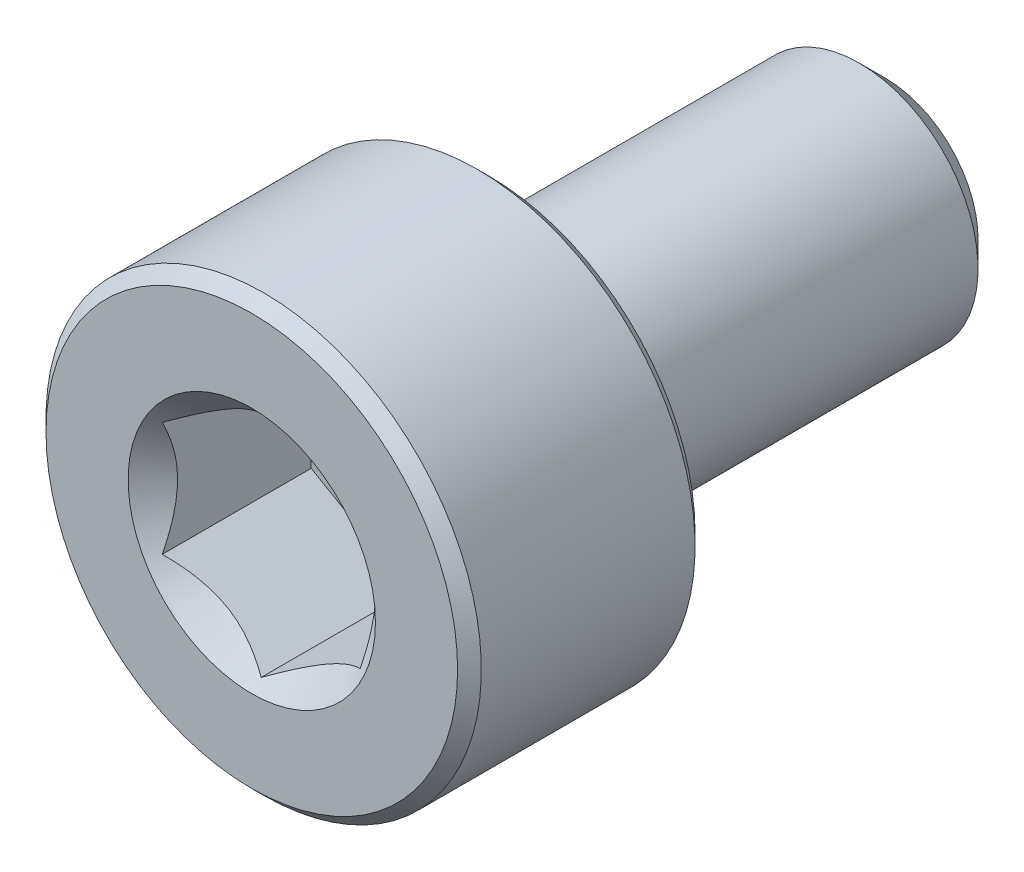
ISO-10303-21;
HEADER;
FILE_DESCRIPTION(('STEP AP214'),'2;1');
FILE_NAME('part.step','',(''),(''),'','','');
FILE_SCHEMA(('AUTOMOTIVE_DESIGN { 1 0 10303 214 1 1 1 1 }'));
ENDSEC;
DATA;
#1=APPLICATION_CONTEXT('core data for automotive mechanical design processes');
#2=APPLICATION_PROTOCOL_DEFINITION('international standard','automotive_design',2000,#1);
#3=PRODUCT_CONTEXT('',#1,'mechanical');
#4=PRODUCT('Part','Part','',(#3));
#5=PRODUCT_RELATED_PRODUCT_CATEGORY('part','',(#4));
#6=PRODUCT_DEFINITION_FORMATION('','',#4);
#7=PRODUCT_DEFINITION_CONTEXT('part definition',#1,'design');
#8=PRODUCT_DEFINITION('design','',#6,#7);
#9=PRODUCT_DEFINITION_SHAPE('','',#8);
#10=(LENGTH_UNIT() NAMED_UNIT(*) SI_UNIT(.MILLI.,.METRE.));
#11=(NAMED_UNIT(*) PLANE_ANGLE_UNIT() SI_UNIT($,.RADIAN.));
#12=(NAMED_UNIT(*) SI_UNIT($,.STERADIAN.) SOLID_ANGLE_UNIT());
#13=UNCERTAINTY_MEASURE_WITH_UNIT(LENGTH_MEASURE(1.E-05),#10,'distance_accuracy_value','');
#14=(GEOMETRIC_REPRESENTATION_CONTEXT(3) GLOBAL_UNCERTAINTY_ASSIGNED_CONTEXT((#13)) GLOBAL_UNIT_ASSIGNED_CONTEXT((#10,
#11,#12)) REPRESENTATION_CONTEXT('',''));
#15=CARTESIAN_POINT('',(0.,0.,0.));
#16=DIRECTION('',(0.,0.,1.));
#17=DIRECTION('',(1.,0.,0.));
#18=AXIS2_PLACEMENT_3D('',#15,#16,#17);
#19=CARTESIAN_POINT('',(0.,1.17524047358084,-4.));
#20=DIRECTION('',(0.,0.,-1.));
#21=DIRECTION('',(0.,1.,0.));
#22=AXIS2_PLACEMENT_3D('',#19,#20,#21);
#23=PLANE('',#22);
#24=CARTESIAN_POINT('',(0.,0.,-4.));
#25=DIRECTION('',(0.,0.,-1.));
#26=DIRECTION('',(0.,1.,0.));
#27=AXIS2_PLACEMENT_3D('',#24,#25,#26);
#28=CIRCLE('',#27,1.17524047358084);
#29=CARTESIAN_POINT('',(0.,1.17524047358084,-4.));
#30=VERTEX_POINT('',#29);
#31=EDGE_CURVE('E54',#30,#30,#28,.T.);
#32=ORIENTED_EDGE('',*,*,#31,.T.);
#33=EDGE_LOOP('',(#32));
#34=FACE_BOUND('',#33,.T.);
#35=ADVANCED_FACE('F41',(#34),#23,.T.);
#36=CARTESIAN_POINT('',(0.,0.,-4.));
#37=DIRECTION('',(0.,0.,1.));
#38=DIRECTION('',(0.,-1.,0.));
#39=AXIS2_PLACEMENT_3D('',#36,#37,#38);
#40=CONICAL_SURFACE('',#39,1.17524047358084,0.785398163397444);
#41=CARTESIAN_POINT('',(0.,0.,-3.67524047358083));
#42=DIRECTION('',(0.,0.,-1.));
#43=DIRECTION('',(0.,1.,0.));
#44=AXIS2_PLACEMENT_3D('',#41,#42,#43);
#45=CIRCLE('',#44,1.5);
#46=CARTESIAN_POINT('',(0.,1.5,-3.67524047358083));
#47=VERTEX_POINT('',#46);
#48=EDGE_CURVE('E157',#47,#47,#45,.T.);
#49=ORIENTED_EDGE('',*,*,#48,.T.);
#50=EDGE_LOOP('',(#49));
#51=FACE_BOUND('',#50,.T.);
#52=ORIENTED_EDGE('',*,*,#31,.F.);
#53=EDGE_LOOP('',(#52));
#54=FACE_BOUND('',#53,.T.);
#55=ADVANCED_FACE('F163',(#51,#54),#40,.T.);
#56=CARTESIAN_POINT('',(0.,0.,-4.));
#57=DIRECTION('',(0.,0.,-1.));
#58=DIRECTION('',(0.,1.,0.));
#59=AXIS2_PLACEMENT_3D('',#56,#57,#58);
#60=CYLINDRICAL_SURFACE('',#59,1.5);
#61=CARTESIAN_POINT('',(0.,0.,0.850000000000002));
#62=DIRECTION('',(0.,0.,-1.));
#63=DIRECTION('',(0.,1.,0.));
#64=AXIS2_PLACEMENT_3D('',#61,#62,#63);
#65=CIRCLE('',#64,1.5);
#66=CARTESIAN_POINT('',(0.,1.5,0.850000000000002));
#67=VERTEX_POINT('',#66);
#68=EDGE_CURVE('E154',#67,#67,#65,.T.);
#69=ORIENTED_EDGE('',*,*,#68,.T.);
#70=EDGE_LOOP('',(#69));
#71=FACE_BOUND('',#70,.T.);
#72=ORIENTED_EDGE('',*,*,#48,.F.);
#73=EDGE_LOOP('',(#72));
#74=FACE_BOUND('',#73,.T.);
#75=ADVANCED_FACE('F165',(#71,#74),#60,.T.);
#76=CARTESIAN_POINT('',(0.,0.,0.850000000000002));
#77=DIRECTION('',(0.,0.,-1.));
#78=DIRECTION('',(0.,1.,0.));
#79=AXIS2_PLACEMENT_3D('',#76,#77,#78);
#80=TOROIDAL_SURFACE('',#79,1.65,0.15);
#81=CARTESIAN_POINT('',(0.,0.,1.));
#82=DIRECTION('',(0.,0.,-1.));
#83=DIRECTION('',(0.,1.,0.));
#84=AXIS2_PLACEMENT_3D('',#81,#82,#83);
#85=CIRCLE('',#84,1.65);
#86=CARTESIAN_POINT('',(0.,1.65,1.));
#87=VERTEX_POINT('',#86);
#88=EDGE_CURVE('E151',#87,#87,#85,.T.);
#89=ORIENTED_EDGE('',*,*,#88,.T.);
#90=EDGE_LOOP('',(#89));
#91=FACE_BOUND('',#90,.T.);
#92=ORIENTED_EDGE('',*,*,#68,.F.);
#93=EDGE_LOOP('',(#92));
#94=FACE_BOUND('',#93,.T.);
#95=ADVANCED_FACE('F171',(#91,#94),#80,.F.);
#96=CARTESIAN_POINT('',(0.,2.6,1.));
#97=DIRECTION('',(0.,0.,-1.));
#98=DIRECTION('',(0.,1.,0.));
#99=AXIS2_PLACEMENT_3D('',#96,#97,#98);
#100=PLANE('',#99);
#101=CARTESIAN_POINT('',(0.,0.,1.));
#102=DIRECTION('',(0.,0.,-1.));
#103=DIRECTION('',(0.,1.,0.));
#104=AXIS2_PLACEMENT_3D('',#101,#102,#103);
#105=CIRCLE('',#104,2.6);
#106=CARTESIAN_POINT('',(0.,2.6,1.));
#107=VERTEX_POINT('',#106);
#108=EDGE_CURVE('E148',#107,#107,#105,.T.);
#109=ORIENTED_EDGE('',*,*,#108,.T.);
#110=EDGE_LOOP('',(#109));
#111=FACE_BOUND('',#110,.T.);
#112=ORIENTED_EDGE('',*,*,#88,.F.);
#113=EDGE_LOOP('',(#112));
#114=FACE_BOUND('',#113,.T.);
#115=ADVANCED_FACE('F177',(#111,#114),#100,.T.);
#116=CARTESIAN_POINT('',(0.,0.,1.));
#117=DIRECTION('',(0.,0.,1.));
#118=DIRECTION('',(0.,-1.,0.));
#119=AXIS2_PLACEMENT_3D('',#116,#117,#118);
#120=CONICAL_SURFACE('',#119,2.6,0.785398163397448);
#121=CARTESIAN_POINT('',(0.,0.,1.15));
#122=DIRECTION('',(0.,0.,-1.));
#123=DIRECTION('',(0.,1.,0.));
#124=AXIS2_PLACEMENT_3D('',#121,#122,#123);
#125=CIRCLE('',#124,2.75);
#126=CARTESIAN_POINT('',(0.,2.75,1.15));
#127=VERTEX_POINT('',#126);
#128=EDGE_CURVE('E145',#127,#127,#125,.T.);
#129=ORIENTED_EDGE('',*,*,#128,.T.);
#130=EDGE_LOOP('',(#129));
#131=FACE_BOUND('',#130,.T.);
#132=ORIENTED_EDGE('',*,*,#108,.F.);
#133=EDGE_LOOP('',(#132));
#134=FACE_BOUND('',#133,.T.);
#135=ADVANCED_FACE('F181',(#131,#134),#120,.T.);
#136=CARTESIAN_POINT('',(0.,0.,-4.));
#137=DIRECTION('',(0.,0.,-1.));
#138=DIRECTION('',(0.,1.,0.));
#139=AXIS2_PLACEMENT_3D('',#136,#137,#138);
#140=CYLINDRICAL_SURFACE('',#139,2.75);
#141=CARTESIAN_POINT('',(0.,0.,3.85));
#142=DIRECTION('',(0.,0.,-1.));
#143=DIRECTION('',(0.,1.,0.));
#144=AXIS2_PLACEMENT_3D('',#141,#142,#143);
#145=CIRCLE('',#144,2.75);
#146=CARTESIAN_POINT('',(0.,2.75,3.85));
#147=VERTEX_POINT('',#146);
#148=EDGE_CURVE('E142',#147,#147,#145,.T.);
#149=ORIENTED_EDGE('',*,*,#148,.T.);
#150=EDGE_LOOP('',(#149));
#151=FACE_BOUND('',#150,.T.);
#152=ORIENTED_EDGE('',*,*,#128,.F.);
#153=EDGE_LOOP('',(#152));
#154=FACE_BOUND('',#153,.T.);
#155=ADVANCED_FACE('F185',(#151,#154),#140,.T.);
#156=CARTESIAN_POINT('',(0.,0.,3.85));
#157=DIRECTION('',(0.,0.,-1.));
#158=DIRECTION('',(0.,1.,0.));
#159=AXIS2_PLACEMENT_3D('',#156,#157,#158);
#160=CONICAL_SURFACE('',#159,2.75,0.785398163397445);
#161=CARTESIAN_POINT('',(0.,0.,4.));
#162=DIRECTION('',(0.,0.,-1.));
#163=DIRECTION('',(0.,1.,0.));
#164=AXIS2_PLACEMENT_3D('',#161,#162,#163);
#165=CIRCLE('',#164,2.6);
#166=CARTESIAN_POINT('',(0.,2.6,4.));
#167=VERTEX_POINT('',#166);
#168=EDGE_CURVE('E139',#167,#167,#165,.T.);
#169=ORIENTED_EDGE('',*,*,#168,.T.);
#170=EDGE_LOOP('',(#169));
#171=FACE_BOUND('',#170,.T.);
#172=ORIENTED_EDGE('',*,*,#148,.F.);
#173=EDGE_LOOP('',(#172));
#174=FACE_BOUND('',#173,.T.);
#175=ADVANCED_FACE('F189',(#171,#174),#160,.T.);
#176=CARTESIAN_POINT('',(0.,0.,4.));
#177=DIRECTION('',(0.,0.,1.));
#178=DIRECTION('',(0.,-1.,0.));
#179=AXIS2_PLACEMENT_3D('',#176,#177,#178);
#180=PLANE('',#179);
#181=CARTESIAN_POINT('',(0.,0.,4.));
#182=DIRECTION('',(0.,0.,1.));
#183=DIRECTION('',(1.,0.,0.));
#184=AXIS2_PLACEMENT_3D('',#181,#182,#183);
#185=CIRCLE('',#184,1.5625);
#186=CARTESIAN_POINT('',(1.5625,0.,4.));
#187=VERTEX_POINT('',#186);
#188=EDGE_CURVE('E113',#187,#187,#185,.T.);
#189=ORIENTED_EDGE('',*,*,#188,.F.);
#190=EDGE_LOOP('',(#189));
#191=FACE_BOUND('',#190,.T.);
#192=ORIENTED_EDGE('',*,*,#168,.F.);
#193=EDGE_LOOP('',(#192));
#194=FACE_BOUND('',#193,.T.);
#195=ADVANCED_FACE('F193',(#191,#194),#180,.T.);
#196=CARTESIAN_POINT('',(0.,0.,4.));
#197=DIRECTION('',(0.,0.,1.));
#198=DIRECTION('',(1.,0.,0.));
#199=AXIS2_PLACEMENT_3D('',#196,#197,#198);
#200=CONICAL_SURFACE('',#199,1.5625,0.78539816339745);
#201=ORIENTED_EDGE('',*,*,#188,.T.);
#202=EDGE_LOOP('',(#201));
#203=FACE_BOUND('',#202,.T.);
#204=CARTESIAN_POINT('',(-0.000200000000000281,-1.4434911430279,3.8809911568832));
#205=CARTESIAN_POINT('',(0.0427751670715864,-1.41867941875065,3.85619734102917));
#206=CARTESIAN_POINT('',(0.0864690047459478,-1.39345276980743,3.83285940739275));
#207=CARTESIAN_POINT('',(0.175565930841942,-1.34201263554194,3.7901276770586));
#208=CARTESIAN_POINT('',(0.220977498357064,-1.31579425481276,3.77075766533448));
#209=CARTESIAN_POINT('',(0.31254782093526,-1.26292610442246,3.73757615638754));
#210=CARTESIAN_POINT('',(0.358683240175885,-1.23628980770471,3.72368123202672));
#211=CARTESIAN_POINT('',(0.451970080407592,-1.18243062538508,3.7022729551347));
#212=CARTESIAN_POINT('',(0.49911864913638,-1.15520938653761,3.69474361454085));
#213=CARTESIAN_POINT('',(0.580373556887252,-1.10829684367467,3.68795017102477));
#214=CARTESIAN_POINT('',(0.614374876627941,-1.08866617256958,3.68694423207841));
#215=CARTESIAN_POINT('',(0.682317764432477,-1.04943932800611,3.68863708788538));
#216=CARTESIAN_POINT('',(0.716259317655657,-1.02984316311599,3.6913367001896));
#217=CARTESIAN_POINT('',(0.783814856457499,-0.990839954603499,3.70028460329044));
#218=CARTESIAN_POINT('',(0.817428507286775,-0.971433104248771,3.70653619887377));
#219=CARTESIAN_POINT('',(0.884094638217813,-0.932943395609905,3.72225135438797));
#220=CARTESIAN_POINT('',(0.917146871030295,-0.9138606800983,3.73171629306152));
#221=CARTESIAN_POINT('',(1.00179969160026,-0.864986351354568,3.75980706366165));
#222=CARTESIAN_POINT('',(1.05286649242964,-0.835502920149076,3.78054583042626));
#223=CARTESIAN_POINT('',(1.15300085411325,-0.777690319475908,3.82726280764554));
#224=CARTESIAN_POINT('',(1.20207431157827,-0.749357745598417,3.85322396892083));
#225=CARTESIAN_POINT('',(1.2502,-0.721572366433194,3.8809911568832));
#226=B_SPLINE_CURVE_WITH_KNOTS('',3,(#204,#205,#206,#207,#208,#209,#210,#211,#212,#213,#214,
#215,#216,#217,#218,#219,#220,#221,#222,#223,#224,#225),.UNSPECIFIED.,.F.,.F.,(4,2,2,2,2,2,2,2,
2,2,4),(0.,0.166533409618304,0.334037607289762,0.498880396489698,0.663307919240275,
0.780963963458827,0.898645970148453,1.01643764860773,1.13427993171549,1.32148652032141,
1.50809158792574),.UNSPECIFIED.);
#227=CARTESIAN_POINT('',(0.,-1.44337567297406,3.88087567297406));
#228=VERTEX_POINT('',#227);
#229=CARTESIAN_POINT('',(1.25,-0.721687836487032,3.88087567297406));
#230=VERTEX_POINT('',#229);
#231=EDGE_CURVE('E12',#228,#230,#226,.T.);
#232=ORIENTED_EDGE('',*,*,#231,.F.);
#233=CARTESIAN_POINT('',(-1.2502,-0.721572366433195,3.8809911568832));
#234=CARTESIAN_POINT('',(-1.20722483292841,-0.746384090710444,3.85619734102917));
#235=CARTESIAN_POINT('',(-1.16353099525405,-0.771610739653665,3.83285940739275));
#236=CARTESIAN_POINT('',(-1.07443406915806,-0.823050873919155,3.7901276770586));
#237=CARTESIAN_POINT('',(-1.02902250164294,-0.849269254648334,3.77075766533448));
#238=CARTESIAN_POINT('',(-0.93745217906474,-0.902137405038636,3.73757615638754));
#239=CARTESIAN_POINT('',(-0.891316759824115,-0.928773701756387,3.72368123202672));
#240=CARTESIAN_POINT('',(-0.798029919592408,-0.982632884076013,3.7022729551347));
#241=CARTESIAN_POINT('',(-0.75088135086362,-1.00985412292348,3.69474361454085));
#242=CARTESIAN_POINT('',(-0.669626443112748,-1.05676666578643,3.68795017102477));
#243=CARTESIAN_POINT('',(-0.635625123372059,-1.07639733689152,3.68694423207841));
#244=CARTESIAN_POINT('',(-0.567682235567522,-1.11562418145499,3.68863708788538));
#245=CARTESIAN_POINT('',(-0.533740682344342,-1.1352203463451,3.6913367001896));
#246=CARTESIAN_POINT('',(-0.4661851435425,-1.1742235548576,3.70028460329044));
#247=CARTESIAN_POINT('',(-0.432571492713225,-1.19363040521233,3.70653619887377));
#248=CARTESIAN_POINT('',(-0.365905361782187,-1.23212011385119,3.72225135438797));
#249=CARTESIAN_POINT('',(-0.332853128969704,-1.2512028293628,3.73171629306152));
#250=CARTESIAN_POINT('',(-0.248200308399735,-1.30007715810653,3.75980706366165));
#251=CARTESIAN_POINT('',(-0.197133507570361,-1.32956058931202,3.78054583042627));
#252=CARTESIAN_POINT('',(-0.0969991458867449,-1.38737318998519,3.82726280764554));
#253=CARTESIAN_POINT('',(-0.0479256884217305,-1.41570576386268,3.85322396892083));
#254=CARTESIAN_POINT('',(0.00019999999999992,-1.4434911430279,3.8809911568832));
#255=B_SPLINE_CURVE_WITH_KNOTS('',3,(#233,#234,#235,#236,#237,#238,#239,#240,#241,#242,#243,
#244,#245,#246,#247,#248,#249,#250,#251,#252,#253,#254),.UNSPECIFIED.,.F.,.F.,(4,2,2,2,2,2,2,2,
2,2,4),(0.,0.166533409618304,0.334037607289762,0.498880396489698,0.663307919240275,
0.780963963458827,0.898645970148453,1.01643764860773,1.1342799317155,1.32148652032141,
1.50809158792574),.UNSPECIFIED.);
#256=CARTESIAN_POINT('',(-1.25,-0.721687836487033,3.88087567297406));
#257=VERTEX_POINT('',#256);
#258=EDGE_CURVE('E99',#257,#228,#255,.T.);
#259=ORIENTED_EDGE('',*,*,#258,.F.);
#260=CARTESIAN_POINT('',(-1.25,-1.52906039618109,4.41247485937656));
#261=CARTESIAN_POINT('',(-1.25,-1.49220529080579,4.38394520440545));
#262=CARTESIAN_POINT('',(-1.25,-1.45515496684494,4.35566856788859));
#263=CARTESIAN_POINT('',(-1.25,-1.38058140838662,4.29972834081338));
#264=CARTESIAN_POINT('',(-1.25,-1.34305806621138,4.27206489394419));
#265=CARTESIAN_POINT('',(-1.25,-1.22910675079842,4.18976023403817));
#266=CARTESIAN_POINT('',(-1.25,-1.15185483124782,4.13624146268623));
#267=CARTESIAN_POINT('',(-1.25,-0.989252377816228,4.03031168703531));
#268=CARTESIAN_POINT('',(-1.25,-0.903702856150537,3.97820301658352));
#269=CARTESIAN_POINT('',(-1.25,-0.728224302589146,3.88229295817095));
#270=CARTESIAN_POINT('',(-1.25,-0.638311408271527,3.83846351429438));
#271=CARTESIAN_POINT('',(-1.25,-0.504179528176993,3.78481796944124));
#272=CARTESIAN_POINT('',(-1.25,-0.462140309604462,3.76958311655924));
#273=CARTESIAN_POINT('',(-1.25,-0.376968358930113,3.74248027967488));
#274=CARTESIAN_POINT('',(-1.25,-0.333835559023206,3.73061250499961));
#275=CARTESIAN_POINT('',(-1.25,-0.247500786382209,3.71108793058395));
#276=CARTESIAN_POINT('',(-1.25,-0.204316746020218,3.70335314062603));
#277=CARTESIAN_POINT('',(-1.25,-0.117386820033729,3.69226051149026));
#278=CARTESIAN_POINT('',(-1.25,-0.0736410606163112,3.68890170591012));
#279=CARTESIAN_POINT('',(-1.25,0.0119255032765032,3.68685912442193));
#280=CARTESIAN_POINT('',(-1.25,0.0537413250189258,3.68796541806101));
#281=CARTESIAN_POINT('',(-1.25,0.137056635467402,3.69430478308355));
#282=CARTESIAN_POINT('',(-1.25,0.178556095869134,3.69953821944028));
#283=CARTESIAN_POINT('',(-1.25,0.261643418190125,3.71392095567135));
#284=CARTESIAN_POINT('',(-1.25,0.303218962688244,3.72314026055592));
#285=CARTESIAN_POINT('',(-1.25,0.385447906554255,3.74497795035777));
#286=CARTESIAN_POINT('',(-1.25,0.426101349364106,3.75759617478337));
#287=CARTESIAN_POINT('',(-1.25,0.55031875610095,3.80099995648882));
#288=CARTESIAN_POINT('',(-1.25,0.632206913819509,3.83656592610618));
#289=CARTESIAN_POINT('',(-1.25,0.792163832901716,3.91573000476451));
#290=CARTESIAN_POINT('',(-1.25,0.870217968244435,3.95935624183847));
#291=CARTESIAN_POINT('',(-1.25,1.01943092253057,4.04945332591182));
#292=CARTESIAN_POINT('',(-1.25,1.09074002929844,4.09567842626371));
#293=CARTESIAN_POINT('',(-1.25,1.19579897437392,4.16717891685916));
#294=CARTESIAN_POINT('',(-1.25,1.23036719648395,4.19127266485707));
#295=CARTESIAN_POINT('',(-1.25,1.29902897795883,4.24010822093429));
#296=CARTESIAN_POINT('',(-1.25,1.33312266558282,4.2648498484799));
#297=CARTESIAN_POINT('',(-1.25,1.36701837723592,4.28986045188314));
#298=B_SPLINE_CURVE_WITH_KNOTS('',3,(#260,#261,#262,#263,#264,#265,#266,#267,#268,#269,#270,
#271,#272,#273,#274,#275,#276,#277,#278,#279,#280,#281,#282,#283,#284,#285,#286,#287,#288,#289,
#290,#291,#292,#293,#294,#295,#296,#297),.UNSPECIFIED.,.F.,.F.,(4,2,2,2,2,2,2,2,2,2,2,2,2,2,2,2,
2,2,4),(0.,0.139818578617194,0.279669581865358,0.561494750208465,0.861785235472755,
1.16103911347106,1.29507141697469,1.42911205127607,1.56052497981098,1.69190888189515,
1.81718933044287,1.94248085908789,2.0700684972633,2.19765011200548,2.46470732734004,
2.73271472961997,2.98752909358604,3.11393310607498,3.24030226282947),.UNSPECIFIED.);
#299=CARTESIAN_POINT('',(-1.25,0.721687836487033,3.88087567297407));
#300=VERTEX_POINT('',#299);
#301=EDGE_CURVE('E112',#300,#257,#298,.F.);
#302=ORIENTED_EDGE('',*,*,#301,.F.);
#303=CARTESIAN_POINT('',(0.000199999999999772,1.4434911430279,3.8809911568832));
#304=CARTESIAN_POINT('',(-0.0427751670715868,1.41867941875065,3.85619734102917));
#305=CARTESIAN_POINT('',(-0.0864690047459481,1.39345276980743,3.83285940739275));
#306=CARTESIAN_POINT('',(-0.175565930841942,1.34201263554194,3.7901276770586));
#307=CARTESIAN_POINT('',(-0.220977498357064,1.31579425481276,3.77075766533448));
#308=CARTESIAN_POINT('',(-0.31254782093526,1.26292610442246,3.73757615638754));
#309=CARTESIAN_POINT('',(-0.358683240175886,1.23628980770471,3.72368123202672));
#310=CARTESIAN_POINT('',(-0.451970080407592,1.18243062538508,3.7022729551347));
#311=CARTESIAN_POINT('',(-0.49911864913638,1.15520938653761,3.69474361454085));
#312=CARTESIAN_POINT('',(-0.580373556887252,1.10829684367467,3.68795017102477));
#313=CARTESIAN_POINT('',(-0.614374876627941,1.08866617256958,3.68694423207842));
#314=CARTESIAN_POINT('',(-0.682317764432477,1.04943932800611,3.68863708788538));
#315=CARTESIAN_POINT('',(-0.716259317655658,1.02984316311599,3.6913367001896));
#316=CARTESIAN_POINT('',(-0.7838148564575,0.9908399546035,3.70028460329044));
#317=CARTESIAN_POINT('',(-0.817428507286775,0.971433104248772,3.70653619887377));
#318=CARTESIAN_POINT('',(-0.884094638217813,0.932943395609906,3.72225135438797));
#319=CARTESIAN_POINT('',(-0.917146871030296,0.913860680098301,3.73171629306152));
#320=CARTESIAN_POINT('',(-1.00179969160026,0.864986351354568,3.75980706366165));
#321=CARTESIAN_POINT('',(-1.05286649242964,0.835502920149076,3.78054583042627));
#322=CARTESIAN_POINT('',(-1.15300085411325,0.777690319475909,3.82726280764554));
#323=CARTESIAN_POINT('',(-1.20207431157827,0.749357745598417,3.85322396892083));
#324=CARTESIAN_POINT('',(-1.2502,0.721572366433195,3.8809911568832));
#325=B_SPLINE_CURVE_WITH_KNOTS('',3,(#303,#304,#305,#306,#307,#308,#309,#310,#311,#312,#313,
#314,#315,#316,#317,#318,#319,#320,#321,#322,#323,#324),.UNSPECIFIED.,.F.,.F.,(4,2,2,2,2,2,2,2,
2,2,4),(0.,0.166533409618303,0.334037607289761,0.498880396489698,0.663307919240274,
0.780963963458826,0.898645970148453,1.01643764860773,1.1342799317155,1.32148652032141,
1.50809158792574),.UNSPECIFIED.);
#326=CARTESIAN_POINT('',(0.,1.44337567297407,3.88087567297407));
#327=VERTEX_POINT('',#326);
#328=EDGE_CURVE('E243',#327,#300,#325,.T.);
#329=ORIENTED_EDGE('',*,*,#328,.F.);
#330=CARTESIAN_POINT('',(1.2502,0.721572366433195,3.8809911568832));
#331=CARTESIAN_POINT('',(1.20722483292841,0.746384090710445,3.85619734102917));
#332=CARTESIAN_POINT('',(1.16353099525405,0.771610739653665,3.83285940739275));
#333=CARTESIAN_POINT('',(1.07443406915806,0.823050873919155,3.7901276770586));
#334=CARTESIAN_POINT('',(1.02902250164294,0.849269254648334,3.77075766533448));
#335=CARTESIAN_POINT('',(0.93745217906474,0.902137405038636,3.73757615638754));
#336=CARTESIAN_POINT('',(0.891316759824114,0.928773701756388,3.72368123202672));
#337=CARTESIAN_POINT('',(0.798029919592408,0.982632884076013,3.7022729551347));
#338=CARTESIAN_POINT('',(0.750881350863621,1.00985412292348,3.69474361454085));
#339=CARTESIAN_POINT('',(0.669626443112748,1.05676666578643,3.68795017102477));
#340=CARTESIAN_POINT('',(0.635625123372059,1.07639733689152,3.68694423207841));
#341=CARTESIAN_POINT('',(0.567682235567523,1.11562418145499,3.68863708788538));
#342=CARTESIAN_POINT('',(0.533740682344343,1.1352203463451,3.6913367001896));
#343=CARTESIAN_POINT('',(0.466185143542501,1.1742235548576,3.70028460329044));
#344=CARTESIAN_POINT('',(0.432571492713225,1.19363040521233,3.70653619887377));
#345=CARTESIAN_POINT('',(0.365905361782187,1.23212011385119,3.72225135438797));
#346=CARTESIAN_POINT('',(0.332853128969705,1.2512028293628,3.73171629306152));
#347=CARTESIAN_POINT('',(0.248200308399736,1.30007715810653,3.75980706366165));
#348=CARTESIAN_POINT('',(0.197133507570362,1.32956058931202,3.78054583042627));
#349=CARTESIAN_POINT('',(0.0969991458867451,1.38737318998519,3.82726280764554));
#350=CARTESIAN_POINT('',(0.0479256884217304,1.41570576386268,3.85322396892083));
#351=CARTESIAN_POINT('',(-0.000200000000000222,1.4434911430279,3.8809911568832));
#352=B_SPLINE_CURVE_WITH_KNOTS('',3,(#330,#331,#332,#333,#334,#335,#336,#337,#338,#339,#340,
#341,#342,#343,#344,#345,#346,#347,#348,#349,#350,#351),.UNSPECIFIED.,.F.,.F.,(4,2,2,2,2,2,2,2,
2,2,4),(0.,0.166533409618303,0.334037607289761,0.498880396489697,0.663307919240273,
0.780963963458826,0.898645970148452,1.01643764860773,1.13427993171549,1.32148652032141,
1.50809158792573),.UNSPECIFIED.);
#353=CARTESIAN_POINT('',(1.25,0.721687836487033,3.88087567297406));
#354=VERTEX_POINT('',#353);
#355=EDGE_CURVE('E216',#354,#327,#352,.T.);
#356=ORIENTED_EDGE('',*,*,#355,.F.);
#357=CARTESIAN_POINT('',(1.25,-1.52905951307294,4.41247417565872));
#358=CARTESIAN_POINT('',(1.25,-1.49220443340975,4.38394454719035));
#359=CARTESIAN_POINT('',(1.25,-1.45515413523639,4.35566793713426));
#360=CARTESIAN_POINT('',(1.25,-1.38058062859442,4.29972776283032));
#361=CARTESIAN_POINT('',(1.25,-1.34305731244813,4.27206434227156));
#362=CARTESIAN_POINT('',(1.25,-1.22910607665359,4.18975976182298));
#363=CARTESIAN_POINT('',(1.25,-1.15185421119604,4.13624104323767));
#364=CARTESIAN_POINT('',(1.25,-0.989251875841039,4.03031137662917));
#365=CARTESIAN_POINT('',(1.25,-0.903702418475841,3.97820276205999));
#366=CARTESIAN_POINT('',(1.25,-0.728223998921329,3.88229280746302));
#367=CARTESIAN_POINT('',(1.25,-0.638311174264586,3.83846341158793));
#368=CARTESIAN_POINT('',(1.25,-0.504179346124883,3.78481790068269));
#369=CARTESIAN_POINT('',(1.25,-0.462140104878464,3.76958304479528));
#370=CARTESIAN_POINT('',(1.25,-0.376968107935322,3.74248020642936));
#371=CARTESIAN_POINT('',(1.25,-0.333835284434423,3.73061243327523));
#372=CARTESIAN_POINT('',(1.25,-0.247500465304423,3.71108786739434));
#373=CARTESIAN_POINT('',(1.25,-0.204316402067131,3.70335308428999));
#374=CARTESIAN_POINT('',(1.25,-0.117386430899383,3.69226047426314));
#375=CARTESIAN_POINT('',(1.25,-0.0736406491759955,3.6889016809363));
#376=CARTESIAN_POINT('',(1.25,0.0119259518544274,3.68685912816713));
#377=CARTESIAN_POINT('',(1.25,0.0537417884860358,3.68796543755722));
#378=CARTESIAN_POINT('',(1.25,0.137057126970277,3.6943048362587));
#379=CARTESIAN_POINT('',(1.25,0.178556600518281,3.69953829054549));
#380=CARTESIAN_POINT('',(1.25,0.261643948783009,3.71392106408938));
#381=CARTESIAN_POINT('',(1.25,0.303219506029026,3.72314038847805));
#382=CARTESIAN_POINT('',(1.25,0.385448473975617,3.7449781174263));
#383=CARTESIAN_POINT('',(1.25,0.426101928118348,3.7575963614937));
#384=CARTESIAN_POINT('',(1.25,0.550319456992717,3.80100023399784));
#385=CARTESIAN_POINT('',(1.25,0.632207719380867,3.83656628684845));
#386=CARTESIAN_POINT('',(1.25,0.792164839741488,3.91573054123008));
#387=CARTESIAN_POINT('',(1.25,0.8702190716438,3.95935687085997));
#388=CARTESIAN_POINT('',(1.25,1.01943219916295,4.04945413200827));
#389=CARTESIAN_POINT('',(1.25,1.09074138323722,4.09567931603778));
#390=CARTESIAN_POINT('',(1.25,1.19580044259576,4.1671799317142));
#391=CARTESIAN_POINT('',(1.25,1.23036870224718,4.19127372107415));
#392=CARTESIAN_POINT('',(1.25,1.29903055855592,4.24010935982246));
#393=CARTESIAN_POINT('',(1.25,1.33312428347233,4.26485102867727));
#394=CARTESIAN_POINT('',(1.25,1.36702003234981,4.28986167333641));
#395=B_SPLINE_CURVE_WITH_KNOTS('',3,(#357,#358,#359,#360,#361,#362,#363,#364,#365,#366,#367,
#368,#369,#370,#371,#372,#373,#374,#375,#376,#377,#378,#379,#380,#381,#382,#383,#384,#385,#386,
#387,#388,#389,#390,#391,#392,#393,#394),.UNSPECIFIED.,.F.,.F.,(4,2,2,2,2,2,2,2,2,2,2,2,2,2,2,2,
2,2,4),(0.,0.139818468955544,0.279669362509984,0.561494307361433,0.861784540728421,
1.16103816927491,1.29507053957457,1.42911124055678,1.56052423261168,1.69190819817627,
1.8171886924228,1.94248026682952,2.07006795499489,2.19764961970652,2.4647072208394,
2.73271501145679,2.98752970662837,3.11393388247469,3.24030320257251),.UNSPECIFIED.);
#396=EDGE_CURVE('E61',#230,#354,#395,.T.);
#397=ORIENTED_EDGE('',*,*,#396,.F.);
#398=EDGE_LOOP('',(#232,#259,#302,#329,#356,#397));
#399=FACE_BOUND('',#398,.T.);
#400=ADVANCED_FACE('F98',(#203,#399),#200,.F.);
#401=CARTESIAN_POINT('',(0.,2.6,2.));
#402=DIRECTION('',(0.,0.,-1.));
#403=DIRECTION('',(0.,1.,0.));
#404=AXIS2_PLACEMENT_3D('',#401,#402,#403);
#405=PLANE('',#404);
#406=DIRECTION('',(0.866025403784439,0.5,0.));
#407=VECTOR('',#406,1.);
#408=CARTESIAN_POINT('',(0.,-1.44337567297406,2.));
#409=LINE('',#408,#407);
#410=CARTESIAN_POINT('',(0.,-1.44337567297406,2.));
#411=VERTEX_POINT('',#410);
#412=CARTESIAN_POINT('',(1.25,-0.721687836487032,2.));
#413=VERTEX_POINT('',#412);
#414=EDGE_CURVE('E116',#411,#413,#409,.T.);
#415=ORIENTED_EDGE('',*,*,#414,.T.);
#416=DIRECTION('',(0.,1.,0.));
#417=VECTOR('',#416,1.);
#418=CARTESIAN_POINT('',(1.25,-0.721687836487032,2.));
#419=LINE('',#418,#417);
#420=CARTESIAN_POINT('',(1.25,0.721687836487033,2.));
#421=VERTEX_POINT('',#420);
#422=EDGE_CURVE('E68',#413,#421,#419,.T.);
#423=ORIENTED_EDGE('',*,*,#422,.T.);
#424=DIRECTION('',(-0.866025403784439,0.5,0.));
#425=VECTOR('',#424,1.);
#426=CARTESIAN_POINT('',(1.25,0.721687836487033,2.));
#427=LINE('',#426,#425);
#428=CARTESIAN_POINT('',(0.,1.44337567297407,2.));
#429=VERTEX_POINT('',#428);
#430=EDGE_CURVE('E124',#421,#429,#427,.T.);
#431=ORIENTED_EDGE('',*,*,#430,.T.);
#432=DIRECTION('',(-0.866025403784439,-0.5,0.));
#433=VECTOR('',#432,1.);
#434=CARTESIAN_POINT('',(0.,1.44337567297407,2.));
#435=LINE('',#434,#433);
#436=CARTESIAN_POINT('',(-1.25,0.721687836487033,2.));
#437=VERTEX_POINT('',#436);
#438=EDGE_CURVE('E131',#429,#437,#435,.T.);
#439=ORIENTED_EDGE('',*,*,#438,.T.);
#440=DIRECTION('',(0.,-1.,0.));
#441=VECTOR('',#440,1.);
#442=CARTESIAN_POINT('',(-1.25,0.721687836487033,2.));
#443=LINE('',#442,#441);
#444=CARTESIAN_POINT('',(-1.25,-0.721687836487033,2.));
#445=VERTEX_POINT('',#444);
#446=EDGE_CURVE('E127',#437,#445,#443,.T.);
#447=ORIENTED_EDGE('',*,*,#446,.T.);
#448=DIRECTION('',(0.866025403784439,-0.5,0.));
#449=VECTOR('',#448,1.);
#450=CARTESIAN_POINT('',(-1.25,-0.721687836487033,2.));
#451=LINE('',#450,#449);
#452=EDGE_CURVE('E117',#445,#411,#451,.T.);
#453=ORIENTED_EDGE('',*,*,#452,.T.);
#454=EDGE_LOOP('',(#415,#423,#431,#439,#447,#453));
#455=FACE_BOUND('',#454,.T.);
#456=ADVANCED_FACE('F198',(#455),#405,.F.);
#457=CARTESIAN_POINT('',(0.,-1.44337567297406,-2.81881307912987));
#458=DIRECTION('',(0.5,-0.866025403784438,0.));
#459=DIRECTION('',(0.866025403784439,0.5,0.));
#460=AXIS2_PLACEMENT_3D('',#457,#458,#459);
#461=PLANE('',#460);
#462=DIRECTION('',(0.,0.,1.));
#463=VECTOR('',#462,1.);
#464=CARTESIAN_POINT('',(0.,-1.44337567297406,-2.81881307912987));
#465=LINE('',#464,#463);
#466=EDGE_CURVE('E108',#411,#228,#465,.T.);
#467=ORIENTED_EDGE('',*,*,#466,.T.);
#468=ORIENTED_EDGE('',*,*,#231,.T.);
#469=DIRECTION('',(0.,0.,1.));
#470=VECTOR('',#469,1.);
#471=CARTESIAN_POINT('',(1.25,-0.721687836487032,-2.81881307912987));
#472=LINE('',#471,#470);
#473=EDGE_CURVE('E119',#413,#230,#472,.T.);
#474=ORIENTED_EDGE('',*,*,#473,.F.);
#475=ORIENTED_EDGE('',*,*,#414,.F.);
#476=EDGE_LOOP('',(#467,#468,#474,#475));
#477=FACE_BOUND('',#476,.T.);
#478=ADVANCED_FACE('F115',(#477),#461,.F.);
#479=CARTESIAN_POINT('',(-1.25,-0.721687836487033,-2.81881307912987));
#480=DIRECTION('',(-0.5,-0.866025403784439,0.));
#481=DIRECTION('',(0.866025403784439,-0.5,0.));
#482=AXIS2_PLACEMENT_3D('',#479,#480,#481);
#483=PLANE('',#482);
#484=DIRECTION('',(0.,0.,1.));
#485=VECTOR('',#484,1.);
#486=CARTESIAN_POINT('',(-1.25,-0.721687836487033,-2.81881307912987));
#487=LINE('',#486,#485);
#488=EDGE_CURVE('E111',#445,#257,#487,.T.);
#489=ORIENTED_EDGE('',*,*,#488,.T.);
#490=ORIENTED_EDGE('',*,*,#258,.T.);
#491=ORIENTED_EDGE('',*,*,#466,.F.);
#492=ORIENTED_EDGE('',*,*,#452,.F.);
#493=EDGE_LOOP('',(#489,#490,#491,#492));
#494=FACE_BOUND('',#493,.T.);
#495=ADVANCED_FACE('F107',(#494),#483,.F.);
#496=CARTESIAN_POINT('',(-1.25,0.721687836487033,-2.81881307912987));
#497=DIRECTION('',(-1.,0.,0.));
#498=DIRECTION('',(0.,-1.,0.));
#499=AXIS2_PLACEMENT_3D('',#496,#497,#498);
#500=PLANE('',#499);
#501=DIRECTION('',(0.,0.,1.));
#502=VECTOR('',#501,1.);
#503=CARTESIAN_POINT('',(-1.25,0.721687836487033,-2.81881307912987));
#504=LINE('',#503,#502);
#505=EDGE_CURVE('E128',#437,#300,#504,.T.);
#506=ORIENTED_EDGE('',*,*,#505,.T.);
#507=ORIENTED_EDGE('',*,*,#301,.T.);
#508=ORIENTED_EDGE('',*,*,#488,.F.);
#509=ORIENTED_EDGE('',*,*,#446,.F.);
#510=EDGE_LOOP('',(#506,#507,#508,#509));
#511=FACE_BOUND('',#510,.T.);
#512=ADVANCED_FACE('F252',(#511),#500,.F.);
#513=CARTESIAN_POINT('',(0.,1.44337567297407,-2.81881307912987));
#514=DIRECTION('',(-0.5,0.866025403784439,0.));
#515=DIRECTION('',(-0.866025403784439,-0.5,0.));
#516=AXIS2_PLACEMENT_3D('',#513,#514,#515);
#517=PLANE('',#516);
#518=DIRECTION('',(0.,0.,1.));
#519=VECTOR('',#518,1.);
#520=CARTESIAN_POINT('',(0.,1.44337567297407,-2.81881307912987));
#521=LINE('',#520,#519);
#522=EDGE_CURVE('E132',#429,#327,#521,.T.);
#523=ORIENTED_EDGE('',*,*,#522,.T.);
#524=ORIENTED_EDGE('',*,*,#328,.T.);
#525=ORIENTED_EDGE('',*,*,#505,.F.);
#526=ORIENTED_EDGE('',*,*,#438,.F.);
#527=EDGE_LOOP('',(#523,#524,#525,#526));
#528=FACE_BOUND('',#527,.T.);
#529=ADVANCED_FACE('F249',(#528),#517,.F.);
#530=CARTESIAN_POINT('',(1.25,0.721687836487033,-2.81881307912987));
#531=DIRECTION('',(0.5,0.866025403784439,0.));
#532=DIRECTION('',(-0.866025403784439,0.5,0.));
#533=AXIS2_PLACEMENT_3D('',#530,#531,#532);
#534=PLANE('',#533);
#535=DIRECTION('',(0.,0.,1.));
#536=VECTOR('',#535,1.);
#537=CARTESIAN_POINT('',(1.25,0.721687836487033,-2.81881307912987));
#538=LINE('',#537,#536);
#539=EDGE_CURVE('E135',#421,#354,#538,.T.);
#540=ORIENTED_EDGE('',*,*,#539,.T.);
#541=ORIENTED_EDGE('',*,*,#355,.T.);
#542=ORIENTED_EDGE('',*,*,#522,.F.);
#543=ORIENTED_EDGE('',*,*,#430,.F.);
#544=EDGE_LOOP('',(#540,#541,#542,#543));
#545=FACE_BOUND('',#544,.T.);
#546=ADVANCED_FACE('F206',(#545),#534,.F.);
#547=CARTESIAN_POINT('',(1.25,-0.721687836487032,-2.81881307912987));
#548=DIRECTION('',(1.,0.,0.));
#549=DIRECTION('',(0.,0.,-1.));
#550=AXIS2_PLACEMENT_3D('',#547,#548,#549);
#551=PLANE('',#550);
#552=ORIENTED_EDGE('',*,*,#473,.T.);
#553=ORIENTED_EDGE('',*,*,#396,.T.);
#554=ORIENTED_EDGE('',*,*,#539,.F.);
#555=ORIENTED_EDGE('',*,*,#422,.F.);
#556=EDGE_LOOP('',(#552,#553,#554,#555));
#557=FACE_BOUND('',#556,.T.);
#558=ADVANCED_FACE('F202',(#557),#551,.F.);
#559=CLOSED_SHELL('',(#35,#55,#75,#95,#115,#135,#155,#175,#195,#400,#456,#478,#495,#512,#529,
#546,#558));
#560=MANIFOLD_SOLID_BREP('B2',#559);
#561=ADVANCED_BREP_SHAPE_REPRESENTATION('',(#18,#560),#14);
#562=SHAPE_DEFINITION_REPRESENTATION(#9,#561);
ENDSEC;
END-ISO-10303-21;
